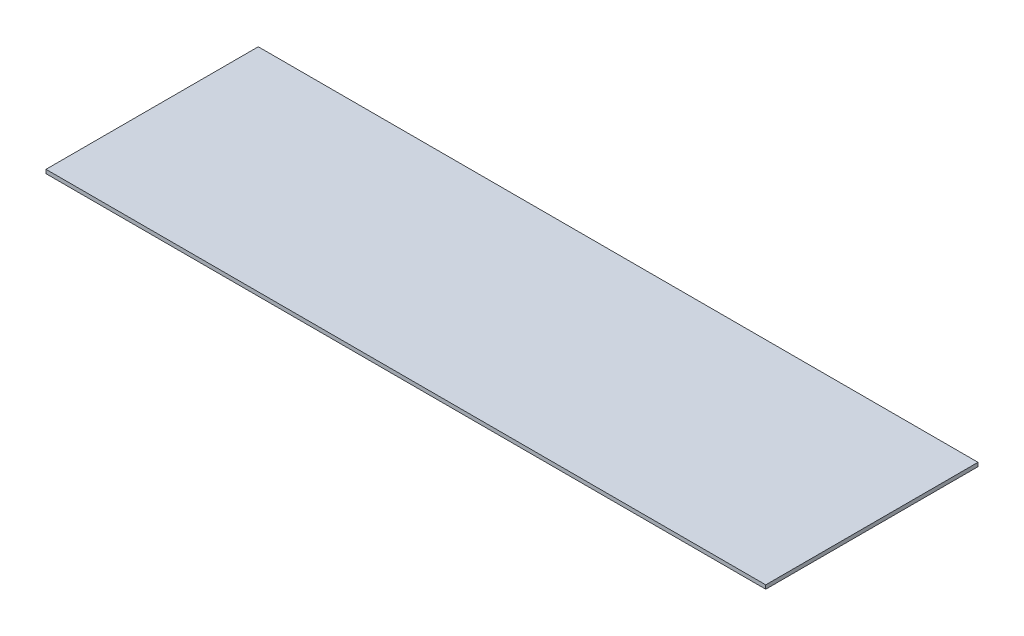
ISO-10303-21;
HEADER;
FILE_DESCRIPTION(('STEP AP214'),'2;1');
FILE_NAME('part.step','',(''),(''),'','','');
FILE_SCHEMA(('AUTOMOTIVE_DESIGN { 1 0 10303 214 1 1 1 1 }'));
ENDSEC;
DATA;
#1=APPLICATION_CONTEXT('core data for automotive mechanical design processes');
#2=APPLICATION_PROTOCOL_DEFINITION('international standard','automotive_design',2000,#1);
#3=PRODUCT_CONTEXT('',#1,'mechanical');
#4=PRODUCT('Part','Part','',(#3));
#5=PRODUCT_RELATED_PRODUCT_CATEGORY('part','',(#4));
#6=PRODUCT_DEFINITION_FORMATION('','',#4);
#7=PRODUCT_DEFINITION_CONTEXT('part definition',#1,'design');
#8=PRODUCT_DEFINITION('design','',#6,#7);
#9=PRODUCT_DEFINITION_SHAPE('','',#8);
#10=(LENGTH_UNIT() NAMED_UNIT(*) SI_UNIT(.MILLI.,.METRE.));
#11=(NAMED_UNIT(*) PLANE_ANGLE_UNIT() SI_UNIT($,.RADIAN.));
#12=(NAMED_UNIT(*) SI_UNIT($,.STERADIAN.) SOLID_ANGLE_UNIT());
#13=UNCERTAINTY_MEASURE_WITH_UNIT(LENGTH_MEASURE(1.E-05),#10,'distance_accuracy_value','');
#14=(GEOMETRIC_REPRESENTATION_CONTEXT(3) GLOBAL_UNCERTAINTY_ASSIGNED_CONTEXT((#13)) GLOBAL_UNIT_ASSIGNED_CONTEXT((#10,
#11,#12)) REPRESENTATION_CONTEXT('',''));
#15=CARTESIAN_POINT('',(0.,0.,0.));
#16=DIRECTION('',(0.,0.,1.));
#17=DIRECTION('',(1.,0.,0.));
#18=AXIS2_PLACEMENT_3D('',#15,#16,#17);
#19=CARTESIAN_POINT('',(-88.991851611549,-10.,-17.3039711466901));
#20=DIRECTION('',(-1.,0.,0.));
#21=DIRECTION('',(0.,0.,1.));
#22=AXIS2_PLACEMENT_3D('',#19,#20,#21);
#23=PLANE('',#22);
#24=DIRECTION('',(0.,0.,1.));
#25=VECTOR('',#24,1.);
#26=CARTESIAN_POINT('',(-88.991851611549,0.,-17.3039711466901));
#27=LINE('',#26,#25);
#28=CARTESIAN_POINT('',(-88.991851611549,0.,-17.3039711466901));
#29=VERTEX_POINT('',#28);
#30=CARTESIAN_POINT('',(-88.991851611549,0.,537.716420619118));
#31=VERTEX_POINT('',#30);
#32=EDGE_CURVE('E109',#29,#31,#27,.T.);
#33=ORIENTED_EDGE('',*,*,#32,.F.);
#34=DIRECTION('',(0.,1.,0.));
#35=VECTOR('',#34,1.);
#36=CARTESIAN_POINT('',(-88.991851611549,-10.,-17.3039711466901));
#37=LINE('',#36,#35);
#38=CARTESIAN_POINT('',(-88.991851611549,-10.,-17.3039711466901));
#39=VERTEX_POINT('',#38);
#40=EDGE_CURVE('E11',#39,#29,#37,.T.);
#41=ORIENTED_EDGE('',*,*,#40,.F.);
#42=DIRECTION('',(0.,0.,1.));
#43=VECTOR('',#42,1.);
#44=CARTESIAN_POINT('',(-88.991851611549,-10.,-17.3039711466901));
#45=LINE('',#44,#43);
#46=CARTESIAN_POINT('',(-88.991851611549,-10.,537.716420619118));
#47=VERTEX_POINT('',#46);
#48=EDGE_CURVE('E101',#39,#47,#45,.T.);
#49=ORIENTED_EDGE('',*,*,#48,.T.);
#50=DIRECTION('',(0.,1.,0.));
#51=VECTOR('',#50,1.);
#52=CARTESIAN_POINT('',(-88.991851611549,-10.,537.716420619118));
#53=LINE('',#52,#51);
#54=EDGE_CURVE('E42',#47,#31,#53,.T.);
#55=ORIENTED_EDGE('',*,*,#54,.T.);
#56=EDGE_LOOP('',(#33,#41,#49,#55));
#57=FACE_BOUND('',#56,.T.);
#58=ADVANCED_FACE('F39',(#57),#23,.T.);
#59=CARTESIAN_POINT('',(-88.991851611549,-10.,-17.3039711466901));
#60=DIRECTION('',(0.,0.,-1.));
#61=DIRECTION('',(-1.,0.,0.));
#62=AXIS2_PLACEMENT_3D('',#59,#60,#61);
#63=PLANE('',#62);
#64=DIRECTION('',(-1.,0.,0.));
#65=VECTOR('',#64,1.);
#66=CARTESIAN_POINT('',(-88.991851611549,0.,-17.3039711466901));
#67=LINE('',#66,#65);
#68=CARTESIAN_POINT('',(1792.95121216889,0.,-17.3039711466901));
#69=VERTEX_POINT('',#68);
#70=EDGE_CURVE('E104',#69,#29,#67,.T.);
#71=ORIENTED_EDGE('',*,*,#70,.F.);
#72=DIRECTION('',(0.,1.,0.));
#73=VECTOR('',#72,1.);
#74=CARTESIAN_POINT('',(1792.95121216889,-10.,-17.3039711466901));
#75=LINE('',#74,#73);
#76=CARTESIAN_POINT('',(1792.95121216889,-10.,-17.3039711466901));
#77=VERTEX_POINT('',#76);
#78=EDGE_CURVE('E49',#77,#69,#75,.T.);
#79=ORIENTED_EDGE('',*,*,#78,.F.);
#80=DIRECTION('',(-1.,0.,0.));
#81=VECTOR('',#80,1.);
#82=CARTESIAN_POINT('',(-88.991851611549,-10.,-17.3039711466901));
#83=LINE('',#82,#81);
#84=EDGE_CURVE('E96',#77,#39,#83,.T.);
#85=ORIENTED_EDGE('',*,*,#84,.T.);
#86=ORIENTED_EDGE('',*,*,#40,.T.);
#87=EDGE_LOOP('',(#71,#79,#85,#86));
#88=FACE_BOUND('',#87,.T.);
#89=ADVANCED_FACE('F125',(#88),#63,.T.);
#90=CARTESIAN_POINT('',(1792.95121216889,-10.,-17.3039711466901));
#91=DIRECTION('',(1.,0.,0.));
#92=DIRECTION('',(0.,0.,-1.));
#93=AXIS2_PLACEMENT_3D('',#90,#91,#92);
#94=PLANE('',#93);
#95=DIRECTION('',(0.,0.,-1.));
#96=VECTOR('',#95,1.);
#97=CARTESIAN_POINT('',(1792.95121216889,0.,-17.3039711466901));
#98=LINE('',#97,#96);
#99=CARTESIAN_POINT('',(1792.95121216889,0.,537.716420619118));
#100=VERTEX_POINT('',#99);
#101=EDGE_CURVE('E90',#100,#69,#98,.T.);
#102=ORIENTED_EDGE('',*,*,#101,.F.);
#103=DIRECTION('',(0.,1.,0.));
#104=VECTOR('',#103,1.);
#105=CARTESIAN_POINT('',(1792.95121216889,-10.,537.716420619118));
#106=LINE('',#105,#104);
#107=CARTESIAN_POINT('',(1792.95121216889,-10.,537.716420619118));
#108=VERTEX_POINT('',#107);
#109=EDGE_CURVE('E85',#108,#100,#106,.T.);
#110=ORIENTED_EDGE('',*,*,#109,.F.);
#111=DIRECTION('',(0.,0.,-1.));
#112=VECTOR('',#111,1.);
#113=CARTESIAN_POINT('',(1792.95121216889,-10.,-17.3039711466901));
#114=LINE('',#113,#112);
#115=EDGE_CURVE('E88',#108,#77,#114,.T.);
#116=ORIENTED_EDGE('',*,*,#115,.T.);
#117=ORIENTED_EDGE('',*,*,#78,.T.);
#118=EDGE_LOOP('',(#102,#110,#116,#117));
#119=FACE_BOUND('',#118,.T.);
#120=ADVANCED_FACE('F87',(#119),#94,.T.);
#121=CARTESIAN_POINT('',(-88.991851611549,-10.,537.716420619118));
#122=DIRECTION('',(0.,0.,1.));
#123=DIRECTION('',(1.,0.,0.));
#124=AXIS2_PLACEMENT_3D('',#121,#122,#123);
#125=PLANE('',#124);
#126=DIRECTION('',(1.,0.,0.));
#127=VECTOR('',#126,1.);
#128=CARTESIAN_POINT('',(-88.991851611549,0.,537.716420619118));
#129=LINE('',#128,#127);
#130=EDGE_CURVE('E113',#31,#100,#129,.T.);
#131=ORIENTED_EDGE('',*,*,#130,.F.);
#132=ORIENTED_EDGE('',*,*,#54,.F.);
#133=DIRECTION('',(1.,0.,0.));
#134=VECTOR('',#133,1.);
#135=CARTESIAN_POINT('',(-88.991851611549,-10.,537.716420619118));
#136=LINE('',#135,#134);
#137=EDGE_CURVE('E95',#47,#108,#136,.T.);
#138=ORIENTED_EDGE('',*,*,#137,.T.);
#139=ORIENTED_EDGE('',*,*,#109,.T.);
#140=EDGE_LOOP('',(#131,#132,#138,#139));
#141=FACE_BOUND('',#140,.T.);
#142=ADVANCED_FACE('F99',(#141),#125,.T.);
#143=CARTESIAN_POINT('',(0.,-10.,0.));
#144=DIRECTION('',(0.,1.,0.));
#145=DIRECTION('',(0.,0.,1.));
#146=AXIS2_PLACEMENT_3D('',#143,#144,#145);
#147=PLANE('',#146);
#148=ORIENTED_EDGE('',*,*,#48,.F.);
#149=ORIENTED_EDGE('',*,*,#84,.F.);
#150=ORIENTED_EDGE('',*,*,#115,.F.);
#151=ORIENTED_EDGE('',*,*,#137,.F.);
#152=EDGE_LOOP('',(#148,#149,#150,#151));
#153=FACE_BOUND('',#152,.T.);
#154=ADVANCED_FACE('F94',(#153),#147,.F.);
#155=CARTESIAN_POINT('',(0.,0.,0.));
#156=DIRECTION('',(0.,1.,0.));
#157=DIRECTION('',(0.,0.,1.));
#158=AXIS2_PLACEMENT_3D('',#155,#156,#157);
#159=PLANE('',#158);
#160=ORIENTED_EDGE('',*,*,#32,.T.);
#161=ORIENTED_EDGE('',*,*,#130,.T.);
#162=ORIENTED_EDGE('',*,*,#101,.T.);
#163=ORIENTED_EDGE('',*,*,#70,.T.);
#164=EDGE_LOOP('',(#160,#161,#162,#163));
#165=FACE_BOUND('',#164,.T.);
#166=ADVANCED_FACE('F124',(#165),#159,.T.);
#167=CLOSED_SHELL('',(#58,#89,#120,#142,#154,#166));
#168=MANIFOLD_SOLID_BREP('B2',#167);
#169=ADVANCED_BREP_SHAPE_REPRESENTATION('',(#18,#168),#14);
#170=SHAPE_DEFINITION_REPRESENTATION(#9,#169);
ENDSEC;
END-ISO-10303-21;
